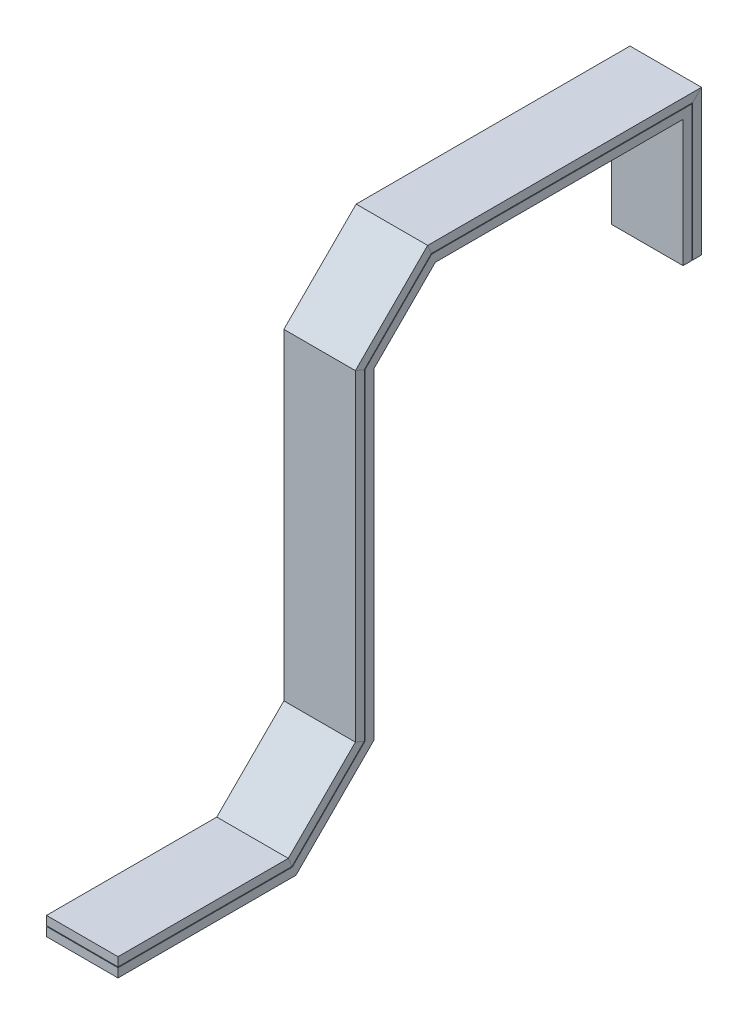
ISO-10303-21;
HEADER;
FILE_DESCRIPTION(('STEP AP214'),'2;1');
FILE_NAME('part.step','',(''),(''),'','','');
FILE_SCHEMA(('AUTOMOTIVE_DESIGN { 1 0 10303 214 1 1 1 1 }'));
ENDSEC;
DATA;
#1=APPLICATION_CONTEXT('core data for automotive mechanical design processes');
#2=APPLICATION_PROTOCOL_DEFINITION('international standard','automotive_design',2000,#1);
#3=PRODUCT_CONTEXT('',#1,'mechanical');
#4=PRODUCT('Part','Part','',(#3));
#5=PRODUCT_RELATED_PRODUCT_CATEGORY('part','',(#4));
#6=PRODUCT_DEFINITION_FORMATION('','',#4);
#7=PRODUCT_DEFINITION_CONTEXT('part definition',#1,'design');
#8=PRODUCT_DEFINITION('design','',#6,#7);
#9=PRODUCT_DEFINITION_SHAPE('','',#8);
#10=(LENGTH_UNIT() NAMED_UNIT(*) SI_UNIT(.MILLI.,.METRE.));
#11=(NAMED_UNIT(*) PLANE_ANGLE_UNIT() SI_UNIT($,.RADIAN.));
#12=(NAMED_UNIT(*) SI_UNIT($,.STERADIAN.) SOLID_ANGLE_UNIT());
#13=UNCERTAINTY_MEASURE_WITH_UNIT(LENGTH_MEASURE(1.E-05),#10,'distance_accuracy_value','');
#14=(GEOMETRIC_REPRESENTATION_CONTEXT(3) GLOBAL_UNCERTAINTY_ASSIGNED_CONTEXT((#13)) GLOBAL_UNIT_ASSIGNED_CONTEXT((#10,
#11,#12)) REPRESENTATION_CONTEXT('',''));
#15=CARTESIAN_POINT('',(0.,0.,0.));
#16=DIRECTION('',(0.,0.,1.));
#17=DIRECTION('',(1.,0.,0.));
#18=AXIS2_PLACEMENT_3D('',#15,#16,#17);
#19=CARTESIAN_POINT('',(25.4,0.,3.655));
#20=DIRECTION('',(0.,-1.,0.));
#21=DIRECTION('',(0.,0.,-1.));
#22=AXIS2_PLACEMENT_3D('',#19,#20,#21);
#23=PLANE('',#22);
#24=DIRECTION('',(0.,0.,1.));
#25=VECTOR('',#24,1.);
#26=CARTESIAN_POINT('',(-25.4,0.,3.655));
#27=LINE('',#26,#25);
#28=CARTESIAN_POINT('',(-25.4,0.,3.655));
#29=VERTEX_POINT('',#28);
#30=CARTESIAN_POINT('',(-25.4,0.,9.965));
#31=VERTEX_POINT('',#30);
#32=EDGE_CURVE('E178',#29,#31,#27,.T.);
#33=ORIENTED_EDGE('',*,*,#32,.F.);
#34=DIRECTION('',(-1.,0.,0.));
#35=VECTOR('',#34,1.);
#36=CARTESIAN_POINT('',(25.4,0.,3.655));
#37=LINE('',#36,#35);
#38=CARTESIAN_POINT('',(25.4,0.,3.655));
#39=VERTEX_POINT('',#38);
#40=EDGE_CURVE('E12',#39,#29,#37,.T.);
#41=ORIENTED_EDGE('',*,*,#40,.F.);
#42=DIRECTION('',(0.,0.,1.));
#43=VECTOR('',#42,1.);
#44=CARTESIAN_POINT('',(25.4,0.,3.655));
#45=LINE('',#44,#43);
#46=CARTESIAN_POINT('',(25.4,0.,9.965));
#47=VERTEX_POINT('',#46);
#48=EDGE_CURVE('E216',#39,#47,#45,.T.);
#49=ORIENTED_EDGE('',*,*,#48,.T.);
#50=DIRECTION('',(-1.,0.,0.));
#51=VECTOR('',#50,1.);
#52=CARTESIAN_POINT('',(25.4,0.,9.965));
#53=LINE('',#52,#51);
#54=EDGE_CURVE('E48',#47,#31,#53,.T.);
#55=ORIENTED_EDGE('',*,*,#54,.T.);
#56=EDGE_LOOP('',(#33,#41,#49,#55));
#57=FACE_BOUND('',#56,.T.);
#58=ADVANCED_FACE('F45',(#57),#23,.T.);
#59=CARTESIAN_POINT('',(25.4,0.,3.655));
#60=DIRECTION('',(0.,0.,-1.));
#61=DIRECTION('',(-1.,0.,0.));
#62=AXIS2_PLACEMENT_3D('',#59,#60,#61);
#63=PLANE('',#62);
#64=DIRECTION('',(0.,-1.,0.));
#65=VECTOR('',#64,1.);
#66=CARTESIAN_POINT('',(-25.4,0.,3.655));
#67=LINE('',#66,#65);
#68=CARTESIAN_POINT('',(-25.4,96.345,3.655));
#69=VERTEX_POINT('',#68);
#70=EDGE_CURVE('E214',#69,#29,#67,.T.);
#71=ORIENTED_EDGE('',*,*,#70,.F.);
#72=DIRECTION('',(-1.,0.,0.));
#73=VECTOR('',#72,1.);
#74=CARTESIAN_POINT('',(25.4,96.345,3.655));
#75=LINE('',#74,#73);
#76=CARTESIAN_POINT('',(25.4,96.345,3.655));
#77=VERTEX_POINT('',#76);
#78=EDGE_CURVE('E54',#77,#69,#75,.T.);
#79=ORIENTED_EDGE('',*,*,#78,.F.);
#80=DIRECTION('',(0.,-1.,0.));
#81=VECTOR('',#80,1.);
#82=CARTESIAN_POINT('',(25.4,0.,3.655));
#83=LINE('',#82,#81);
#84=EDGE_CURVE('E168',#77,#39,#83,.T.);
#85=ORIENTED_EDGE('',*,*,#84,.T.);
#86=ORIENTED_EDGE('',*,*,#40,.T.);
#87=EDGE_LOOP('',(#71,#79,#85,#86));
#88=FACE_BOUND('',#87,.T.);
#89=ADVANCED_FACE('F240',(#88),#63,.T.);
#90=CARTESIAN_POINT('',(25.4,96.345,3.655));
#91=DIRECTION('',(0.,1.,0.));
#92=DIRECTION('',(0.,0.,1.));
#93=AXIS2_PLACEMENT_3D('',#90,#91,#92);
#94=PLANE('',#93);
#95=DIRECTION('',(0.,0.,-1.));
#96=VECTOR('',#95,1.);
#97=CARTESIAN_POINT('',(-25.4,96.345,3.655));
#98=LINE('',#97,#96);
#99=CARTESIAN_POINT('',(-25.4,96.345,188.486049429526));
#100=VERTEX_POINT('',#99);
#101=EDGE_CURVE('E155',#100,#69,#98,.T.);
#102=ORIENTED_EDGE('',*,*,#101,.F.);
#103=DIRECTION('',(-1.,0.,0.));
#104=VECTOR('',#103,1.);
#105=CARTESIAN_POINT('',(25.4,96.345,188.486049429526));
#106=LINE('',#105,#104);
#107=CARTESIAN_POINT('',(25.4,96.345,188.486049429526));
#108=VERTEX_POINT('',#107);
#109=EDGE_CURVE('E150',#108,#100,#106,.T.);
#110=ORIENTED_EDGE('',*,*,#109,.F.);
#111=DIRECTION('',(0.,0.,-1.));
#112=VECTOR('',#111,1.);
#113=CARTESIAN_POINT('',(25.4,96.345,3.655));
#114=LINE('',#113,#112);
#115=EDGE_CURVE('E153',#108,#77,#114,.T.);
#116=ORIENTED_EDGE('',*,*,#115,.T.);
#117=ORIENTED_EDGE('',*,*,#78,.T.);
#118=EDGE_LOOP('',(#102,#110,#116,#117));
#119=FACE_BOUND('',#118,.T.);
#120=ADVANCED_FACE('F152',(#119),#94,.T.);
#121=CARTESIAN_POINT('',(25.4,96.345,188.486049429526));
#122=DIRECTION('',(0.,0.707106781186546,0.707106781186549));
#123=DIRECTION('',(0.,-0.707106781186549,0.707106781186546));
#124=AXIS2_PLACEMENT_3D('',#121,#122,#123);
#125=PLANE('',#124);
#126=DIRECTION('',(0.,0.707106781186549,-0.707106781186546));
#127=VECTOR('',#126,1.);
#128=CARTESIAN_POINT('',(-25.4,96.345,188.486049429526));
#129=LINE('',#128,#127);
#130=CARTESIAN_POINT('',(-25.4,48.988574746468,235.842474683058));
#131=VERTEX_POINT('',#130);
#132=EDGE_CURVE('E211',#131,#100,#129,.T.);
#133=ORIENTED_EDGE('',*,*,#132,.F.);
#134=DIRECTION('',(-1.,0.,0.));
#135=VECTOR('',#134,1.);
#136=CARTESIAN_POINT('',(25.4,48.988574746468,235.842474683058));
#137=LINE('',#136,#135);
#138=CARTESIAN_POINT('',(25.4,48.988574746468,235.842474683058));
#139=VERTEX_POINT('',#138);
#140=EDGE_CURVE('E160',#139,#131,#137,.T.);
#141=ORIENTED_EDGE('',*,*,#140,.F.);
#142=DIRECTION('',(0.,0.707106781186549,-0.707106781186546));
#143=VECTOR('',#142,1.);
#144=CARTESIAN_POINT('',(25.4,96.345,188.486049429526));
#145=LINE('',#144,#143);
#146=EDGE_CURVE('E166',#139,#108,#145,.T.);
#147=ORIENTED_EDGE('',*,*,#146,.T.);
#148=ORIENTED_EDGE('',*,*,#109,.T.);
#149=EDGE_LOOP('',(#133,#141,#147,#148));
#150=FACE_BOUND('',#149,.T.);
#151=ADVANCED_FACE('F170',(#150),#125,.T.);
#152=CARTESIAN_POINT('',(25.4,48.988574746468,235.842474683058));
#153=DIRECTION('',(0.,0.,1.));
#154=DIRECTION('',(0.,-1.,0.));
#155=AXIS2_PLACEMENT_3D('',#152,#153,#154);
#156=PLANE('',#155);
#157=DIRECTION('',(0.,1.,0.));
#158=VECTOR('',#157,1.);
#159=CARTESIAN_POINT('',(-25.4,48.988574746468,235.842474683058));
#160=LINE('',#159,#158);
#161=CARTESIAN_POINT('',(-25.4,-179.516475887415,235.842474683058));
#162=VERTEX_POINT('',#161);
#163=EDGE_CURVE('E208',#162,#131,#160,.T.);
#164=ORIENTED_EDGE('',*,*,#163,.F.);
#165=DIRECTION('',(-1.,0.,0.));
#166=VECTOR('',#165,1.);
#167=CARTESIAN_POINT('',(25.4,-179.516475887415,235.842474683058));
#168=LINE('',#167,#166);
#169=CARTESIAN_POINT('',(25.4,-179.516475887415,235.842474683058));
#170=VERTEX_POINT('',#169);
#171=EDGE_CURVE('E220',#170,#162,#168,.T.);
#172=ORIENTED_EDGE('',*,*,#171,.F.);
#173=DIRECTION('',(0.,1.,0.));
#174=VECTOR('',#173,1.);
#175=CARTESIAN_POINT('',(25.4,48.988574746468,235.842474683058));
#176=LINE('',#175,#174);
#177=EDGE_CURVE('E171',#170,#139,#176,.T.);
#178=ORIENTED_EDGE('',*,*,#177,.T.);
#179=ORIENTED_EDGE('',*,*,#140,.T.);
#180=EDGE_LOOP('',(#164,#172,#178,#179));
#181=FACE_BOUND('',#180,.T.);
#182=ADVANCED_FACE('F253',(#181),#156,.T.);
#183=CARTESIAN_POINT('',(25.4,-179.516475887415,235.842474683058));
#184=DIRECTION('',(0.,0.707106781186546,0.707106781186549));
#185=DIRECTION('',(0.,-0.707106781186549,0.707106781186546));
#186=AXIS2_PLACEMENT_3D('',#183,#184,#185);
#187=PLANE('',#186);
#188=DIRECTION('',(0.,0.707106781186549,-0.707106781186546));
#189=VECTOR('',#188,1.);
#190=CARTESIAN_POINT('',(-25.4,-179.516475887415,235.842474683058));
#191=LINE('',#190,#189);
#192=CARTESIAN_POINT('',(-25.4,-231.155,287.480998795643));
#193=VERTEX_POINT('',#192);
#194=EDGE_CURVE('E205',#193,#162,#191,.T.);
#195=ORIENTED_EDGE('',*,*,#194,.F.);
#196=DIRECTION('',(-1.,0.,0.));
#197=VECTOR('',#196,1.);
#198=CARTESIAN_POINT('',(25.4,-231.155,287.480998795643));
#199=LINE('',#198,#197);
#200=CARTESIAN_POINT('',(25.4,-231.155,287.480998795643));
#201=VERTEX_POINT('',#200);
#202=EDGE_CURVE('E222',#201,#193,#199,.T.);
#203=ORIENTED_EDGE('',*,*,#202,.F.);
#204=DIRECTION('',(0.,0.707106781186549,-0.707106781186546));
#205=VECTOR('',#204,1.);
#206=CARTESIAN_POINT('',(25.4,-179.516475887415,235.842474683058));
#207=LINE('',#206,#205);
#208=EDGE_CURVE('E173',#201,#170,#207,.T.);
#209=ORIENTED_EDGE('',*,*,#208,.T.);
#210=ORIENTED_EDGE('',*,*,#171,.T.);
#211=EDGE_LOOP('',(#195,#203,#209,#210));
#212=FACE_BOUND('',#211,.T.);
#213=ADVANCED_FACE('F256',(#212),#187,.T.);
#214=CARTESIAN_POINT('',(25.4,-231.155,287.480998795643));
#215=DIRECTION('',(0.,1.,0.));
#216=DIRECTION('',(0.,0.,1.));
#217=AXIS2_PLACEMENT_3D('',#214,#215,#216);
#218=PLANE('',#217);
#219=DIRECTION('',(0.,0.,-1.));
#220=VECTOR('',#219,1.);
#221=CARTESIAN_POINT('',(-25.4,-231.155,287.480998795643));
#222=LINE('',#221,#220);
#223=CARTESIAN_POINT('',(-25.4,-231.155,411.224949366117));
#224=VERTEX_POINT('',#223);
#225=EDGE_CURVE('E202',#224,#193,#222,.T.);
#226=ORIENTED_EDGE('',*,*,#225,.F.);
#227=DIRECTION('',(-1.,0.,0.));
#228=VECTOR('',#227,1.);
#229=CARTESIAN_POINT('',(25.4,-231.155,411.224949366117));
#230=LINE('',#229,#228);
#231=CARTESIAN_POINT('',(25.4,-231.155,411.224949366117));
#232=VERTEX_POINT('',#231);
#233=EDGE_CURVE('E224',#232,#224,#230,.T.);
#234=ORIENTED_EDGE('',*,*,#233,.F.);
#235=DIRECTION('',(0.,0.,-1.));
#236=VECTOR('',#235,1.);
#237=CARTESIAN_POINT('',(25.4,-231.155,287.480998795643));
#238=LINE('',#237,#236);
#239=EDGE_CURVE('E413',#232,#201,#238,.T.);
#240=ORIENTED_EDGE('',*,*,#239,.T.);
#241=ORIENTED_EDGE('',*,*,#202,.T.);
#242=EDGE_LOOP('',(#226,#234,#240,#241));
#243=FACE_BOUND('',#242,.T.);
#244=ADVANCED_FACE('F260',(#243),#218,.T.);
#245=CARTESIAN_POINT('',(25.4,-231.155,411.224949366117));
#246=DIRECTION('',(0.,0.,1.));
#247=DIRECTION('',(1.,0.,0.));
#248=AXIS2_PLACEMENT_3D('',#245,#246,#247);
#249=PLANE('',#248);
#250=DIRECTION('',(0.,1.,0.));
#251=VECTOR('',#250,1.);
#252=CARTESIAN_POINT('',(-25.4,-231.155,411.224949366117));
#253=LINE('',#252,#251);
#254=CARTESIAN_POINT('',(-25.4,-237.465,411.224949366117));
#255=VERTEX_POINT('',#254);
#256=EDGE_CURVE('E199',#255,#224,#253,.T.);
#257=ORIENTED_EDGE('',*,*,#256,.F.);
#258=DIRECTION('',(-1.,0.,0.));
#259=VECTOR('',#258,1.);
#260=CARTESIAN_POINT('',(25.4,-237.465,411.224949366117));
#261=LINE('',#260,#259);
#262=CARTESIAN_POINT('',(25.4,-237.465,411.224949366117));
#263=VERTEX_POINT('',#262);
#264=EDGE_CURVE('E226',#263,#255,#261,.T.);
#265=ORIENTED_EDGE('',*,*,#264,.F.);
#266=DIRECTION('',(0.,1.,0.));
#267=VECTOR('',#266,1.);
#268=CARTESIAN_POINT('',(25.4,-231.155,411.224949366117));
#269=LINE('',#268,#267);
#270=EDGE_CURVE('E406',#263,#232,#269,.T.);
#271=ORIENTED_EDGE('',*,*,#270,.T.);
#272=ORIENTED_EDGE('',*,*,#233,.T.);
#273=EDGE_LOOP('',(#257,#265,#271,#272));
#274=FACE_BOUND('',#273,.T.);
#275=ADVANCED_FACE('F264',(#274),#249,.T.);
#276=CARTESIAN_POINT('',(25.4,-237.465,284.867311217068));
#277=DIRECTION('',(0.,-1.,0.));
#278=DIRECTION('',(0.,0.,-1.));
#279=AXIS2_PLACEMENT_3D('',#276,#277,#278);
#280=PLANE('',#279);
#281=DIRECTION('',(0.,0.,1.));
#282=VECTOR('',#281,1.);
#283=CARTESIAN_POINT('',(-25.4,-237.465,284.867311217068));
#284=LINE('',#283,#282);
#285=CARTESIAN_POINT('',(-25.4,-237.465,284.867311217068));
#286=VERTEX_POINT('',#285);
#287=EDGE_CURVE('E196',#286,#255,#284,.T.);
#288=ORIENTED_EDGE('',*,*,#287,.F.);
#289=DIRECTION('',(-1.,0.,0.));
#290=VECTOR('',#289,1.);
#291=CARTESIAN_POINT('',(25.4,-237.465,284.867311217068));
#292=LINE('',#291,#290);
#293=CARTESIAN_POINT('',(25.4,-237.465,284.867311217068));
#294=VERTEX_POINT('',#293);
#295=EDGE_CURVE('E228',#294,#286,#292,.T.);
#296=ORIENTED_EDGE('',*,*,#295,.F.);
#297=DIRECTION('',(0.,0.,1.));
#298=VECTOR('',#297,1.);
#299=CARTESIAN_POINT('',(25.4,-237.465,284.867311217068));
#300=LINE('',#299,#298);
#301=EDGE_CURVE('E402',#294,#263,#300,.T.);
#302=ORIENTED_EDGE('',*,*,#301,.T.);
#303=ORIENTED_EDGE('',*,*,#264,.T.);
#304=EDGE_LOOP('',(#288,#296,#302,#303));
#305=FACE_BOUND('',#304,.T.);
#306=ADVANCED_FACE('F268',(#305),#280,.T.);
#307=CARTESIAN_POINT('',(25.4,-182.130163465989,229.532474683058));
#308=DIRECTION('',(0.,-0.707106781186546,-0.707106781186548));
#309=DIRECTION('',(0.,0.707106781186549,-0.707106781186547));
#310=AXIS2_PLACEMENT_3D('',#307,#308,#309);
#311=PLANE('',#310);
#312=DIRECTION('',(0.,-0.707106781186549,0.707106781186546));
#313=VECTOR('',#312,1.);
#314=CARTESIAN_POINT('',(-25.4,-182.130163465989,229.532474683058));
#315=LINE('',#314,#313);
#316=CARTESIAN_POINT('',(-25.4,-182.130163465989,229.532474683058));
#317=VERTEX_POINT('',#316);
#318=EDGE_CURVE('E193',#317,#286,#315,.T.);
#319=ORIENTED_EDGE('',*,*,#318,.F.);
#320=DIRECTION('',(-1.,0.,0.));
#321=VECTOR('',#320,1.);
#322=CARTESIAN_POINT('',(25.4,-182.130163465989,229.532474683058));
#323=LINE('',#322,#321);
#324=CARTESIAN_POINT('',(25.4,-182.130163465989,229.532474683058));
#325=VERTEX_POINT('',#324);
#326=EDGE_CURVE('E230',#325,#317,#323,.T.);
#327=ORIENTED_EDGE('',*,*,#326,.F.);
#328=DIRECTION('',(0.,-0.707106781186549,0.707106781186546));
#329=VECTOR('',#328,1.);
#330=CARTESIAN_POINT('',(25.4,-182.130163465989,229.532474683058));
#331=LINE('',#330,#329);
#332=EDGE_CURVE('E418',#325,#294,#331,.T.);
#333=ORIENTED_EDGE('',*,*,#332,.T.);
#334=ORIENTED_EDGE('',*,*,#295,.T.);
#335=EDGE_LOOP('',(#319,#327,#333,#334));
#336=FACE_BOUND('',#335,.T.);
#337=ADVANCED_FACE('F272',(#336),#311,.T.);
#338=CARTESIAN_POINT('',(25.4,46.3748871678938,229.532474683058));
#339=DIRECTION('',(0.,0.,-1.));
#340=DIRECTION('',(0.,1.,0.));
#341=AXIS2_PLACEMENT_3D('',#338,#339,#340);
#342=PLANE('',#341);
#343=DIRECTION('',(0.,-1.,0.));
#344=VECTOR('',#343,1.);
#345=CARTESIAN_POINT('',(-25.4,46.3748871678938,229.532474683058));
#346=LINE('',#345,#344);
#347=CARTESIAN_POINT('',(-25.4,46.3748871678938,229.532474683058));
#348=VERTEX_POINT('',#347);
#349=EDGE_CURVE('E190',#348,#317,#346,.T.);
#350=ORIENTED_EDGE('',*,*,#349,.F.);
#351=DIRECTION('',(-1.,0.,0.));
#352=VECTOR('',#351,1.);
#353=CARTESIAN_POINT('',(25.4,46.3748871678938,229.532474683058));
#354=LINE('',#353,#352);
#355=CARTESIAN_POINT('',(25.4,46.3748871678938,229.532474683058));
#356=VERTEX_POINT('',#355);
#357=EDGE_CURVE('E232',#356,#348,#354,.T.);
#358=ORIENTED_EDGE('',*,*,#357,.F.);
#359=DIRECTION('',(0.,-1.,0.));
#360=VECTOR('',#359,1.);
#361=CARTESIAN_POINT('',(25.4,46.3748871678938,229.532474683058));
#362=LINE('',#361,#360);
#363=EDGE_CURVE('E395',#356,#325,#362,.T.);
#364=ORIENTED_EDGE('',*,*,#363,.T.);
#365=ORIENTED_EDGE('',*,*,#326,.T.);
#366=EDGE_LOOP('',(#350,#358,#364,#365));
#367=FACE_BOUND('',#366,.T.);
#368=ADVANCED_FACE('F276',(#367),#342,.T.);
#369=CARTESIAN_POINT('',(25.4,90.035,185.872361850952));
#370=DIRECTION('',(0.,-0.707106781186546,-0.707106781186548));
#371=DIRECTION('',(0.,0.707106781186549,-0.707106781186547));
#372=AXIS2_PLACEMENT_3D('',#369,#370,#371);
#373=PLANE('',#372);
#374=DIRECTION('',(0.,-0.707106781186549,0.707106781186546));
#375=VECTOR('',#374,1.);
#376=CARTESIAN_POINT('',(-25.4,90.035,185.872361850952));
#377=LINE('',#376,#375);
#378=CARTESIAN_POINT('',(-25.4,90.035,185.872361850952));
#379=VERTEX_POINT('',#378);
#380=EDGE_CURVE('E187',#379,#348,#377,.T.);
#381=ORIENTED_EDGE('',*,*,#380,.F.);
#382=DIRECTION('',(-1.,0.,0.));
#383=VECTOR('',#382,1.);
#384=CARTESIAN_POINT('',(25.4,90.035,185.872361850952));
#385=LINE('',#384,#383);
#386=CARTESIAN_POINT('',(25.4,90.035,185.872361850952));
#387=VERTEX_POINT('',#386);
#388=EDGE_CURVE('E234',#387,#379,#385,.T.);
#389=ORIENTED_EDGE('',*,*,#388,.F.);
#390=DIRECTION('',(0.,-0.707106781186549,0.707106781186546));
#391=VECTOR('',#390,1.);
#392=CARTESIAN_POINT('',(25.4,90.035,185.872361850952));
#393=LINE('',#392,#391);
#394=EDGE_CURVE('E391',#387,#356,#393,.T.);
#395=ORIENTED_EDGE('',*,*,#394,.T.);
#396=ORIENTED_EDGE('',*,*,#357,.T.);
#397=EDGE_LOOP('',(#381,#389,#395,#396));
#398=FACE_BOUND('',#397,.T.);
#399=ADVANCED_FACE('F280',(#398),#373,.T.);
#400=CARTESIAN_POINT('',(25.4,90.035,9.965));
#401=DIRECTION('',(0.,-1.,0.));
#402=DIRECTION('',(0.,0.,-1.));
#403=AXIS2_PLACEMENT_3D('',#400,#401,#402);
#404=PLANE('',#403);
#405=DIRECTION('',(0.,0.,1.));
#406=VECTOR('',#405,1.);
#407=CARTESIAN_POINT('',(-25.4,90.035,9.965));
#408=LINE('',#407,#406);
#409=CARTESIAN_POINT('',(-25.4,90.035,9.965));
#410=VERTEX_POINT('',#409);
#411=EDGE_CURVE('E184',#410,#379,#408,.T.);
#412=ORIENTED_EDGE('',*,*,#411,.F.);
#413=DIRECTION('',(-1.,0.,0.));
#414=VECTOR('',#413,1.);
#415=CARTESIAN_POINT('',(25.4,90.035,9.965));
#416=LINE('',#415,#414);
#417=CARTESIAN_POINT('',(25.4,90.035,9.965));
#418=VERTEX_POINT('',#417);
#419=EDGE_CURVE('E235',#418,#410,#416,.T.);
#420=ORIENTED_EDGE('',*,*,#419,.F.);
#421=DIRECTION('',(0.,0.,1.));
#422=VECTOR('',#421,1.);
#423=CARTESIAN_POINT('',(25.4,90.035,9.965));
#424=LINE('',#423,#422);
#425=EDGE_CURVE('E422',#418,#387,#424,.T.);
#426=ORIENTED_EDGE('',*,*,#425,.T.);
#427=ORIENTED_EDGE('',*,*,#388,.T.);
#428=EDGE_LOOP('',(#412,#420,#426,#427));
#429=FACE_BOUND('',#428,.T.);
#430=ADVANCED_FACE('F284',(#429),#404,.T.);
#431=CARTESIAN_POINT('',(25.4,0.,9.965));
#432=DIRECTION('',(0.,0.,1.));
#433=DIRECTION('',(1.,0.,0.));
#434=AXIS2_PLACEMENT_3D('',#431,#432,#433);
#435=PLANE('',#434);
#436=DIRECTION('',(0.,1.,0.));
#437=VECTOR('',#436,1.);
#438=CARTESIAN_POINT('',(-25.4,0.,9.965));
#439=LINE('',#438,#437);
#440=EDGE_CURVE('E181',#31,#410,#439,.T.);
#441=ORIENTED_EDGE('',*,*,#440,.F.);
#442=ORIENTED_EDGE('',*,*,#54,.F.);
#443=DIRECTION('',(0.,1.,0.));
#444=VECTOR('',#443,1.);
#445=CARTESIAN_POINT('',(25.4,0.,9.965));
#446=LINE('',#445,#444);
#447=EDGE_CURVE('E424',#47,#418,#446,.T.);
#448=ORIENTED_EDGE('',*,*,#447,.T.);
#449=ORIENTED_EDGE('',*,*,#419,.T.);
#450=EDGE_LOOP('',(#441,#442,#448,#449));
#451=FACE_BOUND('',#450,.T.);
#452=ADVANCED_FACE('F237',(#451),#435,.T.);
#453=CARTESIAN_POINT('',(25.4,0.,0.));
#454=DIRECTION('',(-1.,0.,0.));
#455=DIRECTION('',(0.,0.,1.));
#456=AXIS2_PLACEMENT_3D('',#453,#454,#455);
#457=PLANE('',#456);
#458=ORIENTED_EDGE('',*,*,#48,.F.);
#459=ORIENTED_EDGE('',*,*,#84,.F.);
#460=ORIENTED_EDGE('',*,*,#115,.F.);
#461=ORIENTED_EDGE('',*,*,#146,.F.);
#462=ORIENTED_EDGE('',*,*,#177,.F.);
#463=ORIENTED_EDGE('',*,*,#208,.F.);
#464=ORIENTED_EDGE('',*,*,#239,.F.);
#465=ORIENTED_EDGE('',*,*,#270,.F.);
#466=ORIENTED_EDGE('',*,*,#301,.F.);
#467=ORIENTED_EDGE('',*,*,#332,.F.);
#468=ORIENTED_EDGE('',*,*,#363,.F.);
#469=ORIENTED_EDGE('',*,*,#394,.F.);
#470=ORIENTED_EDGE('',*,*,#425,.F.);
#471=ORIENTED_EDGE('',*,*,#447,.F.);
#472=EDGE_LOOP('',(#458,#459,#460,#461,#462,#463,#464,#465,#466,#467,#468,#469,#470,#471));
#473=FACE_BOUND('',#472,.T.);
#474=ADVANCED_FACE('F164',(#473),#457,.F.);
#475=CARTESIAN_POINT('',(-25.4,0.,0.));
#476=DIRECTION('',(-1.,0.,0.));
#477=DIRECTION('',(0.,0.,1.));
#478=AXIS2_PLACEMENT_3D('',#475,#476,#477);
#479=PLANE('',#478);
#480=ORIENTED_EDGE('',*,*,#32,.T.);
#481=ORIENTED_EDGE('',*,*,#440,.T.);
#482=ORIENTED_EDGE('',*,*,#411,.T.);
#483=ORIENTED_EDGE('',*,*,#380,.T.);
#484=ORIENTED_EDGE('',*,*,#349,.T.);
#485=ORIENTED_EDGE('',*,*,#318,.T.);
#486=ORIENTED_EDGE('',*,*,#287,.T.);
#487=ORIENTED_EDGE('',*,*,#256,.T.);
#488=ORIENTED_EDGE('',*,*,#225,.T.);
#489=ORIENTED_EDGE('',*,*,#194,.T.);
#490=ORIENTED_EDGE('',*,*,#163,.T.);
#491=ORIENTED_EDGE('',*,*,#132,.T.);
#492=ORIENTED_EDGE('',*,*,#101,.T.);
#493=ORIENTED_EDGE('',*,*,#70,.T.);
#494=EDGE_LOOP('',(#480,#481,#482,#483,#484,#485,#486,#487,#488,#489,#490,#491,#492,#493));
#495=FACE_BOUND('',#494,.T.);
#496=ADVANCED_FACE('F239',(#495),#479,.T.);
#497=CLOSED_SHELL('',(#58,#89,#120,#151,#182,#213,#244,#275,#306,#337,#368,#399,#430,#452,#474,#496));
#498=MANIFOLD_SOLID_BREP('B2',#497);
#499=CARTESIAN_POINT('',(-2.64826289761036E-12,-227.5,411.224949366117));
#500=DIRECTION('',(0.,0.,1.));
#501=DIRECTION('',(0.,-1.,0.));
#502=AXIS2_PLACEMENT_3D('',#499,#500,#501);
#503=PLANE('',#502);
#504=DIRECTION('',(0.,1.,0.));
#505=VECTOR('',#504,1.);
#506=CARTESIAN_POINT('',(25.3999999999974,-224.345,411.224949366117));
#507=LINE('',#506,#505);
#508=CARTESIAN_POINT('',(25.3999999999974,-230.655,411.224949366117));
#509=VERTEX_POINT('',#508);
#510=CARTESIAN_POINT('',(25.3999999999974,-224.345,411.224949366117));
#511=VERTEX_POINT('',#510);
#512=EDGE_CURVE('E516',#509,#511,#507,.T.);
#513=ORIENTED_EDGE('',*,*,#512,.T.);
#514=DIRECTION('',(-1.,0.,0.));
#515=VECTOR('',#514,1.);
#516=CARTESIAN_POINT('',(-25.4000000000026,-224.345,411.224949366117));
#517=LINE('',#516,#515);
#518=CARTESIAN_POINT('',(-25.4000000000026,-224.345,411.224949366117));
#519=VERTEX_POINT('',#518);
#520=EDGE_CURVE('E514',#511,#519,#517,.T.);
#521=ORIENTED_EDGE('',*,*,#520,.T.);
#522=DIRECTION('',(0.,-1.,0.));
#523=VECTOR('',#522,1.);
#524=CARTESIAN_POINT('',(-25.4000000000026,-224.345,411.224949366117));
#525=LINE('',#524,#523);
#526=CARTESIAN_POINT('',(-25.4000000000026,-230.655,411.224949366117));
#527=VERTEX_POINT('',#526);
#528=EDGE_CURVE('E511',#519,#527,#525,.T.);
#529=ORIENTED_EDGE('',*,*,#528,.T.);
#530=DIRECTION('',(1.,0.,0.));
#531=VECTOR('',#530,1.);
#532=CARTESIAN_POINT('',(-25.4000000000026,-230.655,411.224949366117));
#533=LINE('',#532,#531);
#534=EDGE_CURVE('E530',#527,#509,#533,.T.);
#535=ORIENTED_EDGE('',*,*,#534,.T.);
#536=EDGE_LOOP('',(#513,#521,#529,#535));
#537=FACE_BOUND('',#536,.T.);
#538=ADVANCED_FACE('F429',(#537),#503,.T.);
#539=CARTESIAN_POINT('',(0.,0.,0.));
#540=DIRECTION('',(0.,1.,0.));
#541=DIRECTION('',(0.,0.,1.));
#542=AXIS2_PLACEMENT_3D('',#539,#540,#541);
#543=PLANE('',#542);
#544=DIRECTION('',(0.,0.,-1.));
#545=VECTOR('',#544,1.);
#546=CARTESIAN_POINT('',(25.4,0.,-3.155));
#547=LINE('',#546,#545);
#548=CARTESIAN_POINT('',(25.4,0.,3.155));
#549=VERTEX_POINT('',#548);
#550=CARTESIAN_POINT('',(25.4,0.,-3.155));
#551=VERTEX_POINT('',#550);
#552=EDGE_CURVE('E644',#549,#551,#547,.T.);
#553=ORIENTED_EDGE('',*,*,#552,.F.);
#554=DIRECTION('',(1.,0.,0.));
#555=VECTOR('',#554,1.);
#556=CARTESIAN_POINT('',(-25.4,0.,3.155));
#557=LINE('',#556,#555);
#558=CARTESIAN_POINT('',(-25.4,0.,3.155));
#559=VERTEX_POINT('',#558);
#560=EDGE_CURVE('E650',#559,#549,#557,.T.);
#561=ORIENTED_EDGE('',*,*,#560,.F.);
#562=DIRECTION('',(0.,0.,1.));
#563=VECTOR('',#562,1.);
#564=CARTESIAN_POINT('',(-25.4,0.,-3.155));
#565=LINE('',#564,#563);
#566=CARTESIAN_POINT('',(-25.4,0.,-3.155));
#567=VERTEX_POINT('',#566);
#568=EDGE_CURVE('E634',#567,#559,#565,.T.);
#569=ORIENTED_EDGE('',*,*,#568,.F.);
#570=DIRECTION('',(-1.,0.,0.));
#571=VECTOR('',#570,1.);
#572=CARTESIAN_POINT('',(-25.4,0.,-3.155));
#573=LINE('',#572,#571);
#574=EDGE_CURVE('E640',#551,#567,#573,.T.);
#575=ORIENTED_EDGE('',*,*,#574,.F.);
#576=EDGE_LOOP('',(#553,#561,#569,#575));
#577=FACE_BOUND('',#576,.T.);
#578=ADVANCED_FACE('F683',(#577),#543,.F.);
#579=CARTESIAN_POINT('',(-25.4000000000026,-224.345,287.4574211979));
#580=DIRECTION('',(-1.,0.,0.));
#581=DIRECTION('',(0.,-1.,0.));
#582=AXIS2_PLACEMENT_3D('',#579,#580,#581);
#583=PLANE('',#582);
#584=DIRECTION('',(0.,0.923879532511287,0.38268343236509));
#585=VECTOR('',#584,1.);
#586=CARTESIAN_POINT('',(-25.4000000000026,-199.514703414144,300.586838759012));
#587=LINE('',#586,#585);
#588=CARTESIAN_POINT('',(-25.4000000000026,-230.655,287.688105576829));
#589=VERTEX_POINT('',#588);
#590=CARTESIAN_POINT('',(-25.4000000000026,-224.345,290.301793155403));
#591=VERTEX_POINT('',#590);
#592=EDGE_CURVE('E546',#589,#591,#587,.T.);
#593=ORIENTED_EDGE('',*,*,#592,.F.);
#594=DIRECTION('',(0.,0.,1.));
#595=VECTOR('',#594,1.);
#596=CARTESIAN_POINT('',(-25.4000000000026,-230.655,287.4574211979));
#597=LINE('',#596,#595);
#598=EDGE_CURVE('E528',#589,#527,#597,.T.);
#599=ORIENTED_EDGE('',*,*,#598,.T.);
#600=ORIENTED_EDGE('',*,*,#528,.F.);
#601=DIRECTION('',(0.,0.,1.));
#602=VECTOR('',#601,1.);
#603=CARTESIAN_POINT('',(-25.4000000000026,-224.345,287.4574211979));
#604=LINE('',#603,#602);
#605=EDGE_CURVE('E432',#591,#519,#604,.T.);
#606=ORIENTED_EDGE('',*,*,#605,.F.);
#607=EDGE_LOOP('',(#593,#599,#600,#606));
#608=FACE_BOUND('',#607,.T.);
#609=ADVANCED_FACE('F525',(#608),#583,.T.);
#610=CARTESIAN_POINT('',(-25.4000000000026,-230.655,287.4574211979));
#611=DIRECTION('',(0.,-1.,0.));
#612=DIRECTION('',(1.,0.,0.));
#613=AXIS2_PLACEMENT_3D('',#610,#611,#612);
#614=PLANE('',#613);
#615=DIRECTION('',(-1.,0.,0.));
#616=VECTOR('',#615,1.);
#617=CARTESIAN_POINT('',(-25.4000000000018,-230.655,287.688105576829));
#618=LINE('',#617,#616);
#619=CARTESIAN_POINT('',(25.3999999999974,-230.655,287.68810557683));
#620=VERTEX_POINT('',#619);
#621=EDGE_CURVE('E560',#620,#589,#618,.T.);
#622=ORIENTED_EDGE('',*,*,#621,.F.);
#623=DIRECTION('',(0.,0.,1.));
#624=VECTOR('',#623,1.);
#625=CARTESIAN_POINT('',(25.3999999999974,-230.655,287.4574211979));
#626=LINE('',#625,#624);
#627=EDGE_CURVE('E539',#620,#509,#626,.T.);
#628=ORIENTED_EDGE('',*,*,#627,.T.);
#629=ORIENTED_EDGE('',*,*,#534,.F.);
#630=ORIENTED_EDGE('',*,*,#598,.F.);
#631=EDGE_LOOP('',(#622,#628,#629,#630));
#632=FACE_BOUND('',#631,.T.);
#633=ADVANCED_FACE('F740',(#632),#614,.T.);
#634=CARTESIAN_POINT('',(25.3999999999974,-224.345,287.4574211979));
#635=DIRECTION('',(1.,0.,0.));
#636=DIRECTION('',(0.,1.,0.));
#637=AXIS2_PLACEMENT_3D('',#634,#635,#636);
#638=PLANE('',#637);
#639=DIRECTION('',(0.,-0.923879532511287,-0.38268343236509));
#640=VECTOR('',#639,1.);
#641=CARTESIAN_POINT('',(25.3999999999974,-199.514703414144,300.586838759012));
#642=LINE('',#641,#640);
#643=CARTESIAN_POINT('',(25.3999999999974,-224.345,290.301793155404));
#644=VERTEX_POINT('',#643);
#645=EDGE_CURVE('E557',#644,#620,#642,.T.);
#646=ORIENTED_EDGE('',*,*,#645,.F.);
#647=DIRECTION('',(0.,0.,1.));
#648=VECTOR('',#647,1.);
#649=CARTESIAN_POINT('',(25.3999999999974,-224.345,287.4574211979));
#650=LINE('',#649,#648);
#651=EDGE_CURVE('E529',#644,#511,#650,.T.);
#652=ORIENTED_EDGE('',*,*,#651,.T.);
#653=ORIENTED_EDGE('',*,*,#512,.F.);
#654=ORIENTED_EDGE('',*,*,#627,.F.);
#655=EDGE_LOOP('',(#646,#652,#653,#654));
#656=FACE_BOUND('',#655,.T.);
#657=ADVANCED_FACE('F743',(#656),#638,.T.);
#658=CARTESIAN_POINT('',(-25.4000000000026,-224.345,287.4574211979));
#659=DIRECTION('',(0.,1.,0.));
#660=DIRECTION('',(-1.,0.,0.));
#661=AXIS2_PLACEMENT_3D('',#658,#659,#660);
#662=PLANE('',#661);
#663=DIRECTION('',(1.,0.,0.));
#664=VECTOR('',#663,1.);
#665=CARTESIAN_POINT('',(-25.4000000000019,-224.345,290.301793155403));
#666=LINE('',#665,#664);
#667=EDGE_CURVE('E534',#591,#644,#666,.T.);
#668=ORIENTED_EDGE('',*,*,#667,.F.);
#669=ORIENTED_EDGE('',*,*,#605,.T.);
#670=ORIENTED_EDGE('',*,*,#520,.F.);
#671=ORIENTED_EDGE('',*,*,#651,.F.);
#672=EDGE_LOOP('',(#668,#669,#670,#671));
#673=FACE_BOUND('',#672,.T.);
#674=ADVANCED_FACE('F532',(#673),#662,.T.);
#675=CARTESIAN_POINT('',(-25.4000000000013,-174.684406828287,240.64119998369));
#676=DIRECTION('',(0.,0.707106781186547,0.707106781186548));
#677=DIRECTION('',(0.,-0.707106781186548,0.707106781186547));
#678=AXIS2_PLACEMENT_3D('',#675,#676,#677);
#679=PLANE('',#678);
#680=DIRECTION('',(0.,-0.707106781186548,0.707106781186547));
#681=VECTOR('',#680,1.);
#682=CARTESIAN_POINT('',(-25.4000000000013,-174.684406828287,240.64119998369));
#683=LINE('',#682,#681);
#684=CARTESIAN_POINT('',(-25.4000000000014,-176.695681527654,242.652474683058));
#685=VERTEX_POINT('',#684);
#686=EDGE_CURVE('E548',#685,#591,#683,.T.);
#687=ORIENTED_EDGE('',*,*,#686,.T.);
#688=ORIENTED_EDGE('',*,*,#667,.T.);
#689=DIRECTION('',(0.,-0.707106781186548,0.707106781186547));
#690=VECTOR('',#689,1.);
#691=CARTESIAN_POINT('',(25.3999999999987,-174.684406828287,240.641199983691));
#692=LINE('',#691,#690);
#693=CARTESIAN_POINT('',(25.3999999999986,-176.695681527655,242.652474683059));
#694=VERTEX_POINT('',#693);
#695=EDGE_CURVE('E535',#694,#644,#692,.T.);
#696=ORIENTED_EDGE('',*,*,#695,.F.);
#697=DIRECTION('',(1.,0.,0.));
#698=VECTOR('',#697,1.);
#699=CARTESIAN_POINT('',(-25.4000000000024,-176.695681527654,242.652474683058));
#700=LINE('',#699,#698);
#701=EDGE_CURVE('E567',#685,#694,#700,.T.);
#702=ORIENTED_EDGE('',*,*,#701,.F.);
#703=EDGE_LOOP('',(#687,#688,#696,#702));
#704=FACE_BOUND('',#703,.T.);
#705=ADVANCED_FACE('F736',(#704),#679,.T.);
#706=CARTESIAN_POINT('',(25.3999999999987,-174.684406828287,240.641199983691));
#707=DIRECTION('',(1.,0.,0.));
#708=DIRECTION('',(0.,0.,-1.));
#709=AXIS2_PLACEMENT_3D('',#706,#707,#708);
#710=PLANE('',#709);
#711=ORIENTED_EDGE('',*,*,#695,.T.);
#712=ORIENTED_EDGE('',*,*,#645,.T.);
#713=DIRECTION('',(0.,-0.707106781186548,0.707106781186547));
#714=VECTOR('',#713,1.);
#715=CARTESIAN_POINT('',(25.3999999999987,-179.146250617575,236.179356194404));
#716=LINE('',#715,#714);
#717=CARTESIAN_POINT('',(25.3999999999987,-179.309369106229,236.342474683058));
#718=VERTEX_POINT('',#717);
#719=EDGE_CURVE('E537',#718,#620,#716,.T.);
#720=ORIENTED_EDGE('',*,*,#719,.F.);
#721=DIRECTION('',(0.,-0.38268343236509,-0.923879532511287));
#722=VECTOR('',#721,1.);
#723=CARTESIAN_POINT('',(25.3999999999974,-143.198108684873,323.522769346683));
#724=LINE('',#723,#722);
#725=EDGE_CURVE('E581',#694,#718,#724,.T.);
#726=ORIENTED_EDGE('',*,*,#725,.F.);
#727=EDGE_LOOP('',(#711,#712,#720,#726));
#728=FACE_BOUND('',#727,.T.);
#729=ADVANCED_FACE('F727',(#728),#710,.T.);
#730=CARTESIAN_POINT('',(-25.4000000000013,-179.146250617574,236.179356194403));
#731=DIRECTION('',(0.,-0.707106781186547,-0.707106781186548));
#732=DIRECTION('',(0.,0.707106781186548,-0.707106781186547));
#733=AXIS2_PLACEMENT_3D('',#730,#731,#732);
#734=PLANE('',#733);
#735=ORIENTED_EDGE('',*,*,#719,.T.);
#736=ORIENTED_EDGE('',*,*,#621,.T.);
#737=DIRECTION('',(0.,-0.707106781186548,0.707106781186547));
#738=VECTOR('',#737,1.);
#739=CARTESIAN_POINT('',(-25.4000000000013,-179.146250617574,236.179356194403));
#740=LINE('',#739,#738);
#741=CARTESIAN_POINT('',(-25.4000000000013,-179.309369106229,236.342474683058));
#742=VERTEX_POINT('',#741);
#743=EDGE_CURVE('E551',#742,#589,#740,.T.);
#744=ORIENTED_EDGE('',*,*,#743,.F.);
#745=DIRECTION('',(-1.,0.,0.));
#746=VECTOR('',#745,1.);
#747=CARTESIAN_POINT('',(-25.4000000000023,-179.309369106229,236.342474683058));
#748=LINE('',#747,#746);
#749=EDGE_CURVE('E584',#718,#742,#748,.T.);
#750=ORIENTED_EDGE('',*,*,#749,.F.);
#751=EDGE_LOOP('',(#735,#736,#744,#750));
#752=FACE_BOUND('',#751,.T.);
#753=ADVANCED_FACE('F725',(#752),#734,.T.);
#754=CARTESIAN_POINT('',(-25.4000000000013,-174.684406828287,240.64119998369));
#755=DIRECTION('',(-1.,0.,0.));
#756=DIRECTION('',(0.,0.,1.));
#757=AXIS2_PLACEMENT_3D('',#754,#755,#756);
#758=PLANE('',#757);
#759=ORIENTED_EDGE('',*,*,#743,.T.);
#760=ORIENTED_EDGE('',*,*,#592,.T.);
#761=ORIENTED_EDGE('',*,*,#686,.F.);
#762=DIRECTION('',(0.,0.38268343236509,0.923879532511287));
#763=VECTOR('',#762,1.);
#764=CARTESIAN_POINT('',(-25.4000000000026,-143.198108684873,323.522769346682));
#765=LINE('',#764,#763);
#766=EDGE_CURVE('E564',#742,#685,#765,.T.);
#767=ORIENTED_EDGE('',*,*,#766,.F.);
#768=EDGE_LOOP('',(#759,#760,#761,#767));
#769=FACE_BOUND('',#768,.T.);
#770=ADVANCED_FACE('F738',(#769),#758,.T.);
#771=CARTESIAN_POINT('',(-25.4000000000014,52.0400534851575,242.652474683058));
#772=DIRECTION('',(0.,0.,1.));
#773=DIRECTION('',(1.,0.,0.));
#774=AXIS2_PLACEMENT_3D('',#771,#772,#773);
#775=PLANE('',#774);
#776=DIRECTION('',(0.,-1.,0.));
#777=VECTOR('',#776,1.);
#778=CARTESIAN_POINT('',(-25.4000000000014,52.0400534851575,242.652474683058));
#779=LINE('',#778,#777);
#780=CARTESIAN_POINT('',(-25.4000000000014,51.8093691062288,242.652474683058));
#781=VERTEX_POINT('',#780);
#782=EDGE_CURVE('E568',#781,#685,#779,.T.);
#783=ORIENTED_EDGE('',*,*,#782,.T.);
#784=ORIENTED_EDGE('',*,*,#701,.T.);
#785=DIRECTION('',(0.,-1.,0.));
#786=VECTOR('',#785,1.);
#787=CARTESIAN_POINT('',(25.3999999999986,52.0400534851575,242.652474683059));
#788=LINE('',#787,#786);
#789=CARTESIAN_POINT('',(25.3999999999986,51.8093691062286,242.652474683059));
#790=VERTEX_POINT('',#789);
#791=EDGE_CURVE('E563',#790,#694,#788,.T.);
#792=ORIENTED_EDGE('',*,*,#791,.F.);
#793=DIRECTION('',(1.,0.,0.));
#794=VECTOR('',#793,1.);
#795=CARTESIAN_POINT('',(-25.400000000001,51.8093691062288,242.652474683058));
#796=LINE('',#795,#794);
#797=EDGE_CURVE('E591',#781,#790,#796,.T.);
#798=ORIENTED_EDGE('',*,*,#797,.F.);
#799=EDGE_LOOP('',(#783,#784,#792,#798));
#800=FACE_BOUND('',#799,.T.);
#801=ADVANCED_FACE('F733',(#800),#775,.T.);
#802=CARTESIAN_POINT('',(25.3999999999986,52.0400534851575,242.652474683059));
#803=DIRECTION('',(1.,0.,0.));
#804=DIRECTION('',(0.,0.,-1.));
#805=AXIS2_PLACEMENT_3D('',#802,#803,#804);
#806=PLANE('',#805);
#807=ORIENTED_EDGE('',*,*,#791,.T.);
#808=ORIENTED_EDGE('',*,*,#725,.T.);
#809=DIRECTION('',(0.,-1.,0.));
#810=VECTOR('',#809,1.);
#811=CARTESIAN_POINT('',(25.3999999999987,52.0400534851575,236.342474683059));
#812=LINE('',#811,#810);
#813=CARTESIAN_POINT('',(25.3999999999987,49.1956815276545,236.342474683059));
#814=VERTEX_POINT('',#813);
#815=EDGE_CURVE('E574',#814,#718,#812,.T.);
#816=ORIENTED_EDGE('',*,*,#815,.F.);
#817=DIRECTION('',(0.,-0.382683432365089,-0.923879532511287));
#818=VECTOR('',#817,1.);
#819=CARTESIAN_POINT('',(25.399999999999,41.1415578186899,216.898099991846));
#820=LINE('',#819,#818);
#821=EDGE_CURVE('E605',#790,#814,#820,.T.);
#822=ORIENTED_EDGE('',*,*,#821,.F.);
#823=EDGE_LOOP('',(#807,#808,#816,#822));
#824=FACE_BOUND('',#823,.T.);
#825=ADVANCED_FACE('F730',(#824),#806,.T.);
#826=CARTESIAN_POINT('',(-25.4000000000013,52.0400534851575,236.342474683058));
#827=DIRECTION('',(0.,0.,-1.));
#828=DIRECTION('',(-1.,0.,0.));
#829=AXIS2_PLACEMENT_3D('',#826,#827,#828);
#830=PLANE('',#829);
#831=ORIENTED_EDGE('',*,*,#815,.T.);
#832=ORIENTED_EDGE('',*,*,#749,.T.);
#833=DIRECTION('',(0.,-1.,0.));
#834=VECTOR('',#833,1.);
#835=CARTESIAN_POINT('',(-25.4000000000013,52.0400534851575,236.342474683058));
#836=LINE('',#835,#834);
#837=CARTESIAN_POINT('',(-25.4000000000013,49.1956815276546,236.342474683058));
#838=VERTEX_POINT('',#837);
#839=EDGE_CURVE('E571',#838,#742,#836,.T.);
#840=ORIENTED_EDGE('',*,*,#839,.F.);
#841=DIRECTION('',(-1.,0.,0.));
#842=VECTOR('',#841,1.);
#843=CARTESIAN_POINT('',(-25.400000000001,49.1956815276546,236.342474683058));
#844=LINE('',#843,#842);
#845=EDGE_CURVE('E608',#814,#838,#844,.T.);
#846=ORIENTED_EDGE('',*,*,#845,.F.);
#847=EDGE_LOOP('',(#831,#832,#840,#846));
#848=FACE_BOUND('',#847,.T.);
#849=ADVANCED_FACE('F720',(#848),#830,.T.);
#850=CARTESIAN_POINT('',(-25.4000000000014,52.0400534851575,242.652474683058));
#851=DIRECTION('',(-1.,0.,0.));
#852=DIRECTION('',(0.,0.,1.));
#853=AXIS2_PLACEMENT_3D('',#850,#851,#852);
#854=PLANE('',#853);
#855=ORIENTED_EDGE('',*,*,#839,.T.);
#856=ORIENTED_EDGE('',*,*,#766,.T.);
#857=ORIENTED_EDGE('',*,*,#782,.F.);
#858=DIRECTION('',(0.,0.382683432365089,0.923879532511287));
#859=VECTOR('',#858,1.);
#860=CARTESIAN_POINT('',(-25.400000000001,41.1415578186901,216.898099991845));
#861=LINE('',#860,#859);
#862=EDGE_CURVE('E588',#838,#781,#861,.T.);
#863=ORIENTED_EDGE('',*,*,#862,.F.);
#864=EDGE_LOOP('',(#855,#856,#857,#863));
#865=FACE_BOUND('',#864,.T.);
#866=ADVANCED_FACE('F718',(#865),#854,.T.);
#867=CARTESIAN_POINT('',(-25.4,103.318118488655,191.143725300632));
#868=DIRECTION('',(0.,0.707106781186546,0.707106781186549));
#869=DIRECTION('',(0.,-0.707106781186549,0.707106781186546));
#870=AXIS2_PLACEMENT_3D('',#867,#868,#869);
#871=PLANE('',#870);
#872=DIRECTION('',(0.,-0.707106781186549,0.707106781186546));
#873=VECTOR('',#872,1.);
#874=CARTESIAN_POINT('',(-25.4,103.318118488655,191.143725300632));
#875=LINE('',#874,#873);
#876=CARTESIAN_POINT('',(-25.4,103.155,191.306843789287));
#877=VERTEX_POINT('',#876);
#878=EDGE_CURVE('E592',#877,#781,#875,.T.);
#879=ORIENTED_EDGE('',*,*,#878,.T.);
#880=ORIENTED_EDGE('',*,*,#797,.T.);
#881=DIRECTION('',(0.,-0.707106781186549,0.707106781186546));
#882=VECTOR('',#881,1.);
#883=CARTESIAN_POINT('',(25.4,103.318118488654,191.143725300633));
#884=LINE('',#883,#882);
#885=CARTESIAN_POINT('',(25.4,103.155,191.306843789287));
#886=VERTEX_POINT('',#885);
#887=EDGE_CURVE('E587',#886,#790,#884,.T.);
#888=ORIENTED_EDGE('',*,*,#887,.F.);
#889=DIRECTION('',(1.,0.,0.));
#890=VECTOR('',#889,1.);
#891=CARTESIAN_POINT('',(-25.4000000000022,103.155,191.306843789287));
#892=LINE('',#891,#890);
#893=EDGE_CURVE('E615',#877,#886,#892,.T.);
#894=ORIENTED_EDGE('',*,*,#893,.F.);
#895=EDGE_LOOP('',(#879,#880,#888,#894));
#896=FACE_BOUND('',#895,.T.);
#897=ADVANCED_FACE('F712',(#896),#871,.T.);
#898=CARTESIAN_POINT('',(25.4,103.318118488654,191.143725300633));
#899=DIRECTION('',(1.,0.,0.));
#900=DIRECTION('',(0.,0.,-1.));
#901=AXIS2_PLACEMENT_3D('',#898,#899,#900);
#902=PLANE('',#901);
#903=ORIENTED_EDGE('',*,*,#887,.T.);
#904=ORIENTED_EDGE('',*,*,#821,.T.);
#905=DIRECTION('',(0.,-0.707106781186549,0.707106781186546));
#906=VECTOR('',#905,1.);
#907=CARTESIAN_POINT('',(25.4000000000001,98.8562746993672,186.681881511346));
#908=LINE('',#907,#906);
#909=CARTESIAN_POINT('',(25.4,96.8450000000001,188.693156210713));
#910=VERTEX_POINT('',#909);
#911=EDGE_CURVE('E598',#910,#814,#908,.T.);
#912=ORIENTED_EDGE('',*,*,#911,.F.);
#913=DIRECTION('',(0.,-0.923879532511287,-0.382683432365091));
#914=VECTOR('',#913,1.);
#915=CARTESIAN_POINT('',(25.4,34.2554543534863,162.767717541157));
#916=LINE('',#915,#914);
#917=EDGE_CURVE('E628',#886,#910,#916,.T.);
#918=ORIENTED_EDGE('',*,*,#917,.F.);
#919=EDGE_LOOP('',(#903,#904,#912,#918));
#920=FACE_BOUND('',#919,.T.);
#921=ADVANCED_FACE('F706',(#920),#902,.T.);
#922=CARTESIAN_POINT('',(-25.3999999999999,98.8562746993676,186.681881511345));
#923=DIRECTION('',(0.,-0.707106781186546,-0.707106781186549));
#924=DIRECTION('',(0.,0.707106781186549,-0.707106781186546));
#925=AXIS2_PLACEMENT_3D('',#922,#923,#924);
#926=PLANE('',#925);
#927=ORIENTED_EDGE('',*,*,#911,.T.);
#928=ORIENTED_EDGE('',*,*,#845,.T.);
#929=DIRECTION('',(0.,-0.707106781186549,0.707106781186546));
#930=VECTOR('',#929,1.);
#931=CARTESIAN_POINT('',(-25.3999999999999,98.8562746993676,186.681881511345));
#932=LINE('',#931,#930);
#933=CARTESIAN_POINT('',(-25.4,96.845,188.693156210713));
#934=VERTEX_POINT('',#933);
#935=EDGE_CURVE('E595',#934,#838,#932,.T.);
#936=ORIENTED_EDGE('',*,*,#935,.F.);
#937=DIRECTION('',(-1.,0.,0.));
#938=VECTOR('',#937,1.);
#939=CARTESIAN_POINT('',(-25.4000000000021,96.845,188.693156210713));
#940=LINE('',#939,#938);
#941=EDGE_CURVE('E631',#910,#934,#940,.T.);
#942=ORIENTED_EDGE('',*,*,#941,.F.);
#943=EDGE_LOOP('',(#927,#928,#936,#942));
#944=FACE_BOUND('',#943,.T.);
#945=ADVANCED_FACE('F704',(#944),#926,.T.);
#946=CARTESIAN_POINT('',(-25.4,103.318118488655,191.143725300632));
#947=DIRECTION('',(-1.,0.,0.));
#948=DIRECTION('',(0.,0.,1.));
#949=AXIS2_PLACEMENT_3D('',#946,#947,#948);
#950=PLANE('',#949);
#951=ORIENTED_EDGE('',*,*,#935,.T.);
#952=ORIENTED_EDGE('',*,*,#862,.T.);
#953=ORIENTED_EDGE('',*,*,#878,.F.);
#954=DIRECTION('',(0.,0.923879532511287,0.382683432365091));
#955=VECTOR('',#954,1.);
#956=CARTESIAN_POINT('',(-25.4,34.2554543534865,162.767717541157));
#957=LINE('',#956,#955);
#958=EDGE_CURVE('E612',#934,#877,#957,.T.);
#959=ORIENTED_EDGE('',*,*,#958,.F.);
#960=EDGE_LOOP('',(#951,#952,#953,#959));
#961=FACE_BOUND('',#960,.T.);
#962=ADVANCED_FACE('F714',(#961),#950,.T.);
#963=CARTESIAN_POINT('',(-25.4,103.155,-3.57049999999999));
#964=DIRECTION('',(0.,1.,0.));
#965=DIRECTION('',(0.,0.,1.));
#966=AXIS2_PLACEMENT_3D('',#963,#964,#965);
#967=PLANE('',#966);
#968=DIRECTION('',(0.,0.,1.));
#969=VECTOR('',#968,1.);
#970=CARTESIAN_POINT('',(-25.4,103.155,-3.57049999999999));
#971=LINE('',#970,#969);
#972=CARTESIAN_POINT('',(-25.4,103.155,-3.155));
#973=VERTEX_POINT('',#972);
#974=EDGE_CURVE('E616',#973,#877,#971,.T.);
#975=ORIENTED_EDGE('',*,*,#974,.T.);
#976=ORIENTED_EDGE('',*,*,#893,.T.);
#977=DIRECTION('',(0.,0.,1.));
#978=VECTOR('',#977,1.);
#979=CARTESIAN_POINT('',(25.4,103.155,-3.57049999999999));
#980=LINE('',#979,#978);
#981=CARTESIAN_POINT('',(25.4,103.155,-3.155));
#982=VERTEX_POINT('',#981);
#983=EDGE_CURVE('E611',#982,#886,#980,.T.);
#984=ORIENTED_EDGE('',*,*,#983,.F.);
#985=DIRECTION('',(1.,0.,0.));
#986=VECTOR('',#985,1.);
#987=CARTESIAN_POINT('',(-25.4,103.155,-3.155));
#988=LINE('',#987,#986);
#989=EDGE_CURVE('E638',#973,#982,#988,.T.);
#990=ORIENTED_EDGE('',*,*,#989,.F.);
#991=EDGE_LOOP('',(#975,#976,#984,#990));
#992=FACE_BOUND('',#991,.T.);
#993=ADVANCED_FACE('F709',(#992),#967,.T.);
#994=CARTESIAN_POINT('',(25.4,103.155,-3.57049999999999));
#995=DIRECTION('',(1.,0.,0.));
#996=DIRECTION('',(0.,0.,-1.));
#997=AXIS2_PLACEMENT_3D('',#994,#995,#996);
#998=PLANE('',#997);
#999=ORIENTED_EDGE('',*,*,#983,.T.);
#1000=ORIENTED_EDGE('',*,*,#917,.T.);
#1001=DIRECTION('',(0.,0.,1.));
#1002=VECTOR('',#1001,1.);
#1003=CARTESIAN_POINT('',(25.4,96.845,-3.57049999999999));
#1004=LINE('',#1003,#1002);
#1005=CARTESIAN_POINT('',(25.4,96.845,3.15500000000001));
#1006=VERTEX_POINT('',#1005);
#1007=EDGE_CURVE('E622',#1006,#910,#1004,.T.);
#1008=ORIENTED_EDGE('',*,*,#1007,.F.);
#1009=DIRECTION('',(0.,-0.707106781186548,0.707106781186548));
#1010=VECTOR('',#1009,1.);
#1011=CARTESIAN_POINT('',(25.4,51.5775,48.4225));
#1012=LINE('',#1011,#1010);
#1013=EDGE_CURVE('E438',#982,#1006,#1012,.T.);
#1014=ORIENTED_EDGE('',*,*,#1013,.F.);
#1015=EDGE_LOOP('',(#999,#1000,#1008,#1014));
#1016=FACE_BOUND('',#1015,.T.);
#1017=ADVANCED_FACE('F708',(#1016),#998,.T.);
#1018=CARTESIAN_POINT('',(-25.4,96.845,-3.57049999999999));
#1019=DIRECTION('',(0.,-1.,0.));
#1020=DIRECTION('',(0.,0.,-1.));
#1021=AXIS2_PLACEMENT_3D('',#1018,#1019,#1020);
#1022=PLANE('',#1021);
#1023=ORIENTED_EDGE('',*,*,#1007,.T.);
#1024=ORIENTED_EDGE('',*,*,#941,.T.);
#1025=DIRECTION('',(0.,0.,1.));
#1026=VECTOR('',#1025,1.);
#1027=CARTESIAN_POINT('',(-25.4,96.845,-3.57049999999999));
#1028=LINE('',#1027,#1026);
#1029=CARTESIAN_POINT('',(-25.4,96.845,3.15500000000001));
#1030=VERTEX_POINT('',#1029);
#1031=EDGE_CURVE('E619',#1030,#934,#1028,.T.);
#1032=ORIENTED_EDGE('',*,*,#1031,.F.);
#1033=DIRECTION('',(-1.,0.,0.));
#1034=VECTOR('',#1033,1.);
#1035=CARTESIAN_POINT('',(-25.4,96.845,3.155));
#1036=LINE('',#1035,#1034);
#1037=EDGE_CURVE('E43',#1006,#1030,#1036,.T.);
#1038=ORIENTED_EDGE('',*,*,#1037,.F.);
#1039=EDGE_LOOP('',(#1023,#1024,#1032,#1038));
#1040=FACE_BOUND('',#1039,.T.);
#1041=ADVANCED_FACE('F700',(#1040),#1022,.T.);
#1042=CARTESIAN_POINT('',(-25.4,103.155,-3.57049999999999));
#1043=DIRECTION('',(-1.,0.,0.));
#1044=DIRECTION('',(0.,0.,1.));
#1045=AXIS2_PLACEMENT_3D('',#1042,#1043,#1044);
#1046=PLANE('',#1045);
#1047=ORIENTED_EDGE('',*,*,#1031,.T.);
#1048=ORIENTED_EDGE('',*,*,#958,.T.);
#1049=ORIENTED_EDGE('',*,*,#974,.F.);
#1050=DIRECTION('',(0.,0.707106781186548,-0.707106781186548));
#1051=VECTOR('',#1050,1.);
#1052=CARTESIAN_POINT('',(-25.4,51.5775,48.4225));
#1053=LINE('',#1052,#1051);
#1054=EDGE_CURVE('E635',#1030,#973,#1053,.T.);
#1055=ORIENTED_EDGE('',*,*,#1054,.F.);
#1056=EDGE_LOOP('',(#1047,#1048,#1049,#1055));
#1057=FACE_BOUND('',#1056,.T.);
#1058=ADVANCED_FACE('F699',(#1057),#1046,.T.);
#1059=CARTESIAN_POINT('',(-25.4,0.,-3.155));
#1060=DIRECTION('',(0.,0.,-1.));
#1061=DIRECTION('',(-1.,0.,0.));
#1062=AXIS2_PLACEMENT_3D('',#1059,#1060,#1061);
#1063=PLANE('',#1062);
#1064=DIRECTION('',(0.,1.,0.));
#1065=VECTOR('',#1064,1.);
#1066=CARTESIAN_POINT('',(-25.4,0.,-3.155));
#1067=LINE('',#1066,#1065);
#1068=EDGE_CURVE('E643',#567,#973,#1067,.T.);
#1069=ORIENTED_EDGE('',*,*,#1068,.T.);
#1070=ORIENTED_EDGE('',*,*,#989,.T.);
#1071=DIRECTION('',(0.,1.,0.));
#1072=VECTOR('',#1071,1.);
#1073=CARTESIAN_POINT('',(25.4,0.,-3.155));
#1074=LINE('',#1073,#1072);
#1075=EDGE_CURVE('E639',#551,#982,#1074,.T.);
#1076=ORIENTED_EDGE('',*,*,#1075,.F.);
#1077=ORIENTED_EDGE('',*,*,#574,.T.);
#1078=EDGE_LOOP('',(#1069,#1070,#1076,#1077));
#1079=FACE_BOUND('',#1078,.T.);
#1080=ADVANCED_FACE('F692',(#1079),#1063,.T.);
#1081=CARTESIAN_POINT('',(25.4,0.,-3.155));
#1082=DIRECTION('',(1.,0.,0.));
#1083=DIRECTION('',(0.,0.,-1.));
#1084=AXIS2_PLACEMENT_3D('',#1081,#1082,#1083);
#1085=PLANE('',#1084);
#1086=ORIENTED_EDGE('',*,*,#1075,.T.);
#1087=ORIENTED_EDGE('',*,*,#1013,.T.);
#1088=DIRECTION('',(0.,1.,0.));
#1089=VECTOR('',#1088,1.);
#1090=CARTESIAN_POINT('',(25.4,0.,3.155));
#1091=LINE('',#1090,#1089);
#1092=EDGE_CURVE('E647',#549,#1006,#1091,.T.);
#1093=ORIENTED_EDGE('',*,*,#1092,.F.);
#1094=ORIENTED_EDGE('',*,*,#552,.T.);
#1095=EDGE_LOOP('',(#1086,#1087,#1093,#1094));
#1096=FACE_BOUND('',#1095,.T.);
#1097=ADVANCED_FACE('F667',(#1096),#1085,.T.);
#1098=CARTESIAN_POINT('',(-25.4,0.,3.155));
#1099=DIRECTION('',(0.,0.,1.));
#1100=DIRECTION('',(1.,0.,0.));
#1101=AXIS2_PLACEMENT_3D('',#1098,#1099,#1100);
#1102=PLANE('',#1101);
#1103=ORIENTED_EDGE('',*,*,#1092,.T.);
#1104=ORIENTED_EDGE('',*,*,#1037,.T.);
#1105=DIRECTION('',(0.,1.,0.));
#1106=VECTOR('',#1105,1.);
#1107=CARTESIAN_POINT('',(-25.4,0.,3.155));
#1108=LINE('',#1107,#1106);
#1109=EDGE_CURVE('E653',#559,#1030,#1108,.T.);
#1110=ORIENTED_EDGE('',*,*,#1109,.F.);
#1111=ORIENTED_EDGE('',*,*,#560,.T.);
#1112=EDGE_LOOP('',(#1103,#1104,#1110,#1111));
#1113=FACE_BOUND('',#1112,.T.);
#1114=ADVANCED_FACE('F673',(#1113),#1102,.T.);
#1115=CARTESIAN_POINT('',(-25.4,0.,-3.155));
#1116=DIRECTION('',(-1.,0.,0.));
#1117=DIRECTION('',(0.,0.,1.));
#1118=AXIS2_PLACEMENT_3D('',#1115,#1116,#1117);
#1119=PLANE('',#1118);
#1120=ORIENTED_EDGE('',*,*,#1109,.T.);
#1121=ORIENTED_EDGE('',*,*,#1054,.T.);
#1122=ORIENTED_EDGE('',*,*,#1068,.F.);
#1123=ORIENTED_EDGE('',*,*,#568,.T.);
#1124=EDGE_LOOP('',(#1120,#1121,#1122,#1123));
#1125=FACE_BOUND('',#1124,.T.);
#1126=ADVANCED_FACE('F688',(#1125),#1119,.T.);
#1127=CLOSED_SHELL('',(#538,#578,#609,#633,#657,#674,#705,#729,#753,#770,#801,#825,#849,#866,
#897,#921,#945,#962,#993,#1017,#1041,#1058,#1080,#1097,#1114,#1126));
#1128=MANIFOLD_SOLID_BREP('B6',#1127);
#1129=ADVANCED_BREP_SHAPE_REPRESENTATION('',(#18,#498,#1128),#14);
#1130=SHAPE_DEFINITION_REPRESENTATION(#9,#1129);
ENDSEC;
END-ISO-10303-21;
